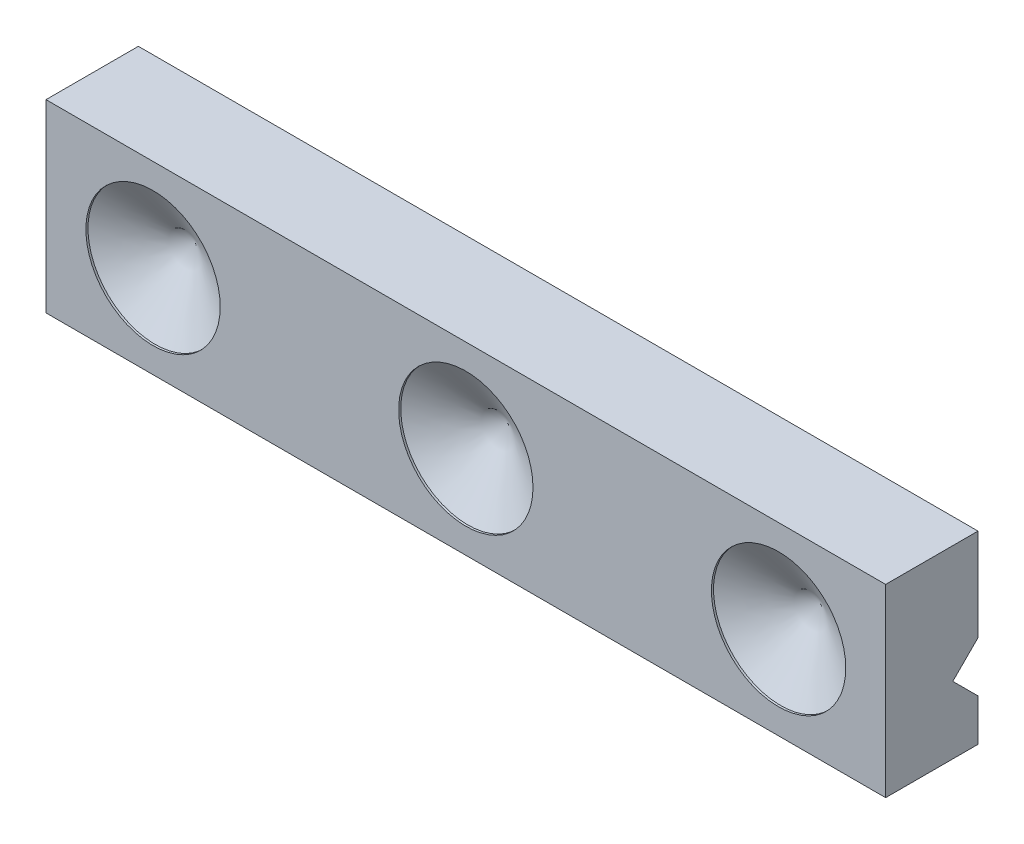
ISO-10303-21;
HEADER;
FILE_DESCRIPTION(('STEP AP214'),'2;1');
FILE_NAME('part.step','',(''),(''),'','','');
FILE_SCHEMA(('AUTOMOTIVE_DESIGN { 1 0 10303 214 1 1 1 1 }'));
ENDSEC;
DATA;
#1=APPLICATION_CONTEXT('core data for automotive mechanical design processes');
#2=APPLICATION_PROTOCOL_DEFINITION('international standard','automotive_design',2000,#1);
#3=PRODUCT_CONTEXT('',#1,'mechanical');
#4=PRODUCT('Part','Part','',(#3));
#5=PRODUCT_RELATED_PRODUCT_CATEGORY('part','',(#4));
#6=PRODUCT_DEFINITION_FORMATION('','',#4);
#7=PRODUCT_DEFINITION_CONTEXT('part definition',#1,'design');
#8=PRODUCT_DEFINITION('design','',#6,#7);
#9=PRODUCT_DEFINITION_SHAPE('','',#8);
#10=(LENGTH_UNIT() NAMED_UNIT(*) SI_UNIT(.MILLI.,.METRE.));
#11=(NAMED_UNIT(*) PLANE_ANGLE_UNIT() SI_UNIT($,.RADIAN.));
#12=(NAMED_UNIT(*) SI_UNIT($,.STERADIAN.) SOLID_ANGLE_UNIT());
#13=UNCERTAINTY_MEASURE_WITH_UNIT(LENGTH_MEASURE(1.E-05),#10,'distance_accuracy_value','');
#14=(GEOMETRIC_REPRESENTATION_CONTEXT(3) GLOBAL_UNCERTAINTY_ASSIGNED_CONTEXT((#13)) GLOBAL_UNIT_ASSIGNED_CONTEXT((#10,
#11,#12)) REPRESENTATION_CONTEXT('',''));
#15=CARTESIAN_POINT('',(0.,0.,0.));
#16=DIRECTION('',(0.,0.,1.));
#17=DIRECTION('',(1.,0.,0.));
#18=AXIS2_PLACEMENT_3D('',#15,#16,#17);
#19=CARTESIAN_POINT('',(-10.,-1.60000000000001,19.5));
#20=DIRECTION('',(1.,0.,0.));
#21=DIRECTION('',(0.,0.,-1.));
#22=AXIS2_PLACEMENT_3D('',#19,#20,#21);
#23=PLANE('',#22);
#24=DIRECTION('',(0.,0.,-1.));
#25=VECTOR('',#24,1.);
#26=CARTESIAN_POINT('',(-10.,2.8,19.5));
#27=LINE('',#26,#25);
#28=CARTESIAN_POINT('',(-10.,2.8,19.5));
#29=VERTEX_POINT('',#28);
#30=CARTESIAN_POINT('',(-10.,2.8,17.3));
#31=VERTEX_POINT('',#30);
#32=EDGE_CURVE('E205',#29,#31,#27,.T.);
#33=ORIENTED_EDGE('',*,*,#32,.T.);
#34=DIRECTION('',(0.,1.,0.));
#35=VECTOR('',#34,1.);
#36=CARTESIAN_POINT('',(-10.,2.8,17.3));
#37=LINE('',#36,#35);
#38=CARTESIAN_POINT('',(-10.,0.600000000000007,17.3));
#39=VERTEX_POINT('',#38);
#40=EDGE_CURVE('E174',#39,#31,#37,.T.);
#41=ORIENTED_EDGE('',*,*,#40,.F.);
#42=DIRECTION('',(0.,-0.707106781186542,0.707106781186553));
#43=VECTOR('',#42,1.);
#44=CARTESIAN_POINT('',(-10.,-1.59999999999999,19.5));
#45=LINE('',#44,#43);
#46=CARTESIAN_POINT('',(-10.,0.,17.9));
#47=VERTEX_POINT('',#46);
#48=EDGE_CURVE('E70',#39,#47,#45,.T.);
#49=ORIENTED_EDGE('',*,*,#48,.T.);
#50=DIRECTION('',(0.,-0.707106781186542,-0.707106781186553));
#51=VECTOR('',#50,1.);
#52=CARTESIAN_POINT('',(-10.,0.,17.9));
#53=LINE('',#52,#51);
#54=CARTESIAN_POINT('',(-10.,-0.6,17.3));
#55=VERTEX_POINT('',#54);
#56=EDGE_CURVE('E219',#47,#55,#53,.T.);
#57=ORIENTED_EDGE('',*,*,#56,.T.);
#58=DIRECTION('',(0.,1.,0.));
#59=VECTOR('',#58,1.);
#60=CARTESIAN_POINT('',(-10.,-1.60000000000001,17.3));
#61=LINE('',#60,#59);
#62=CARTESIAN_POINT('',(-10.,-1.60000000000001,17.3));
#63=VERTEX_POINT('',#62);
#64=EDGE_CURVE('E178',#63,#55,#61,.T.);
#65=ORIENTED_EDGE('',*,*,#64,.F.);
#66=DIRECTION('',(0.,0.,-1.));
#67=VECTOR('',#66,1.);
#68=CARTESIAN_POINT('',(-10.,-1.60000000000001,19.5));
#69=LINE('',#68,#67);
#70=CARTESIAN_POINT('',(-10.,-1.60000000000001,19.5));
#71=VERTEX_POINT('',#70);
#72=EDGE_CURVE('E214',#71,#63,#69,.T.);
#73=ORIENTED_EDGE('',*,*,#72,.F.);
#74=DIRECTION('',(0.,-1.,0.));
#75=VECTOR('',#74,1.);
#76=CARTESIAN_POINT('',(-10.,-1.60000000000001,19.5));
#77=LINE('',#76,#75);
#78=EDGE_CURVE('E193',#29,#71,#77,.T.);
#79=ORIENTED_EDGE('',*,*,#78,.F.);
#80=EDGE_LOOP('',(#33,#41,#49,#57,#65,#73,#79));
#81=FACE_BOUND('',#80,.T.);
#82=ADVANCED_FACE('F59',(#81),#23,.F.);
#83=CARTESIAN_POINT('',(-10.,-1.60000000000001,19.5));
#84=DIRECTION('',(0.,1.,0.));
#85=DIRECTION('',(0.,0.,1.));
#86=AXIS2_PLACEMENT_3D('',#83,#84,#85);
#87=PLANE('',#86);
#88=ORIENTED_EDGE('',*,*,#72,.T.);
#89=DIRECTION('',(-1.,0.,0.));
#90=VECTOR('',#89,1.);
#91=CARTESIAN_POINT('',(10.,-1.60000000000001,17.3));
#92=LINE('',#91,#90);
#93=CARTESIAN_POINT('',(10.,-1.60000000000001,17.3));
#94=VERTEX_POINT('',#93);
#95=EDGE_CURVE('E189',#94,#63,#92,.T.);
#96=ORIENTED_EDGE('',*,*,#95,.F.);
#97=DIRECTION('',(0.,0.,-1.));
#98=VECTOR('',#97,1.);
#99=CARTESIAN_POINT('',(10.,-1.60000000000001,19.5));
#100=LINE('',#99,#98);
#101=CARTESIAN_POINT('',(10.,-1.60000000000001,19.5));
#102=VERTEX_POINT('',#101);
#103=EDGE_CURVE('E211',#102,#94,#100,.T.);
#104=ORIENTED_EDGE('',*,*,#103,.F.);
#105=DIRECTION('',(1.,0.,0.));
#106=VECTOR('',#105,1.);
#107=CARTESIAN_POINT('',(-10.,-1.60000000000001,19.5));
#108=LINE('',#107,#106);
#109=EDGE_CURVE('E197',#71,#102,#108,.T.);
#110=ORIENTED_EDGE('',*,*,#109,.F.);
#111=EDGE_LOOP('',(#88,#96,#104,#110));
#112=FACE_BOUND('',#111,.T.);
#113=ADVANCED_FACE('F302',(#112),#87,.F.);
#114=CARTESIAN_POINT('',(10.,-1.60000000000001,19.5));
#115=DIRECTION('',(-1.,0.,0.));
#116=DIRECTION('',(0.,0.,1.));
#117=AXIS2_PLACEMENT_3D('',#114,#115,#116);
#118=PLANE('',#117);
#119=ORIENTED_EDGE('',*,*,#103,.T.);
#120=DIRECTION('',(0.,-1.,0.));
#121=VECTOR('',#120,1.);
#122=CARTESIAN_POINT('',(10.,-0.6,17.3));
#123=LINE('',#122,#121);
#124=CARTESIAN_POINT('',(10.,-0.6,17.3));
#125=VERTEX_POINT('',#124);
#126=EDGE_CURVE('E185',#125,#94,#123,.T.);
#127=ORIENTED_EDGE('',*,*,#126,.F.);
#128=DIRECTION('',(0.,0.707106781186542,0.707106781186553));
#129=VECTOR('',#128,1.);
#130=CARTESIAN_POINT('',(10.,0.,17.9));
#131=LINE('',#130,#129);
#132=CARTESIAN_POINT('',(10.,0.,17.9));
#133=VERTEX_POINT('',#132);
#134=EDGE_CURVE('E83',#125,#133,#131,.T.);
#135=ORIENTED_EDGE('',*,*,#134,.T.);
#136=DIRECTION('',(0.,0.707106781186542,-0.707106781186553));
#137=VECTOR('',#136,1.);
#138=CARTESIAN_POINT('',(10.,-1.59999999999999,19.5));
#139=LINE('',#138,#137);
#140=CARTESIAN_POINT('',(10.,0.600000000000007,17.3));
#141=VERTEX_POINT('',#140);
#142=EDGE_CURVE('E11',#133,#141,#139,.T.);
#143=ORIENTED_EDGE('',*,*,#142,.T.);
#144=DIRECTION('',(0.,-1.,0.));
#145=VECTOR('',#144,1.);
#146=CARTESIAN_POINT('',(10.,0.600000000000007,17.3));
#147=LINE('',#146,#145);
#148=CARTESIAN_POINT('',(10.,2.8,17.3));
#149=VERTEX_POINT('',#148);
#150=EDGE_CURVE('E166',#149,#141,#147,.T.);
#151=ORIENTED_EDGE('',*,*,#150,.F.);
#152=DIRECTION('',(0.,0.,-1.));
#153=VECTOR('',#152,1.);
#154=CARTESIAN_POINT('',(10.,2.8,19.5));
#155=LINE('',#154,#153);
#156=CARTESIAN_POINT('',(10.,2.8,19.5));
#157=VERTEX_POINT('',#156);
#158=EDGE_CURVE('E208',#157,#149,#155,.T.);
#159=ORIENTED_EDGE('',*,*,#158,.F.);
#160=DIRECTION('',(0.,1.,0.));
#161=VECTOR('',#160,1.);
#162=CARTESIAN_POINT('',(10.,-1.60000000000001,19.5));
#163=LINE('',#162,#161);
#164=EDGE_CURVE('E200',#102,#157,#163,.T.);
#165=ORIENTED_EDGE('',*,*,#164,.F.);
#166=EDGE_LOOP('',(#119,#127,#135,#143,#151,#159,#165));
#167=FACE_BOUND('',#166,.T.);
#168=ADVANCED_FACE('F285',(#167),#118,.F.);
#169=CARTESIAN_POINT('',(-10.,2.8,19.5));
#170=DIRECTION('',(0.,-1.,0.));
#171=DIRECTION('',(0.,0.,-1.));
#172=AXIS2_PLACEMENT_3D('',#169,#170,#171);
#173=PLANE('',#172);
#174=ORIENTED_EDGE('',*,*,#158,.T.);
#175=DIRECTION('',(1.,0.,0.));
#176=VECTOR('',#175,1.);
#177=CARTESIAN_POINT('',(10.,2.8,17.3));
#178=LINE('',#177,#176);
#179=EDGE_CURVE('E170',#31,#149,#178,.T.);
#180=ORIENTED_EDGE('',*,*,#179,.F.);
#181=ORIENTED_EDGE('',*,*,#32,.F.);
#182=DIRECTION('',(-1.,0.,0.));
#183=VECTOR('',#182,1.);
#184=CARTESIAN_POINT('',(-10.,2.8,19.5));
#185=LINE('',#184,#183);
#186=EDGE_CURVE('E203',#157,#29,#185,.T.);
#187=ORIENTED_EDGE('',*,*,#186,.F.);
#188=EDGE_LOOP('',(#174,#180,#181,#187));
#189=FACE_BOUND('',#188,.T.);
#190=ADVANCED_FACE('F292',(#189),#173,.F.);
#191=CARTESIAN_POINT('',(0.,0.,19.5));
#192=DIRECTION('',(0.,0.,-1.));
#193=DIRECTION('',(-1.,0.,0.));
#194=AXIS2_PLACEMENT_3D('',#191,#192,#193);
#195=PLANE('',#194);
#196=CARTESIAN_POINT('',(-7.45,0.600000000000002,19.5));
#197=DIRECTION('',(0.,0.,1.));
#198=DIRECTION('',(1.,0.,0.));
#199=AXIS2_PLACEMENT_3D('',#196,#197,#198);
#200=CIRCLE('',#199,1.6);
#201=CARTESIAN_POINT('',(-5.85,0.600000000000002,19.5));
#202=VERTEX_POINT('',#201);
#203=EDGE_CURVE('E139',#202,#202,#200,.T.);
#204=ORIENTED_EDGE('',*,*,#203,.F.);
#205=EDGE_LOOP('',(#204));
#206=FACE_BOUND('',#205,.T.);
#207=CARTESIAN_POINT('',(0.,0.600000000000002,19.5));
#208=DIRECTION('',(0.,0.,1.));
#209=DIRECTION('',(1.,0.,0.));
#210=AXIS2_PLACEMENT_3D('',#207,#208,#209);
#211=CIRCLE('',#210,1.6);
#212=CARTESIAN_POINT('',(1.6,0.600000000000002,19.5));
#213=VERTEX_POINT('',#212);
#214=EDGE_CURVE('E138',#213,#213,#211,.T.);
#215=ORIENTED_EDGE('',*,*,#214,.F.);
#216=EDGE_LOOP('',(#215));
#217=FACE_BOUND('',#216,.T.);
#218=CARTESIAN_POINT('',(7.45000000000001,0.600000000000002,19.5));
#219=DIRECTION('',(0.,0.,1.));
#220=DIRECTION('',(1.,0.,0.));
#221=AXIS2_PLACEMENT_3D('',#218,#219,#220);
#222=CIRCLE('',#221,1.6);
#223=CARTESIAN_POINT('',(9.05000000000001,0.600000000000002,19.5));
#224=VERTEX_POINT('',#223);
#225=EDGE_CURVE('E155',#224,#224,#222,.T.);
#226=ORIENTED_EDGE('',*,*,#225,.F.);
#227=EDGE_LOOP('',(#226));
#228=FACE_BOUND('',#227,.T.);
#229=ORIENTED_EDGE('',*,*,#78,.T.);
#230=ORIENTED_EDGE('',*,*,#109,.T.);
#231=ORIENTED_EDGE('',*,*,#164,.T.);
#232=ORIENTED_EDGE('',*,*,#186,.T.);
#233=EDGE_LOOP('',(#229,#230,#231,#232));
#234=FACE_BOUND('',#233,.T.);
#235=ADVANCED_FACE('F298',(#206,#217,#228,#234),#195,.F.);
#236=CARTESIAN_POINT('',(0.,0.,17.3));
#237=DIRECTION('',(0.,0.,-1.));
#238=DIRECTION('',(-1.,0.,0.));
#239=AXIS2_PLACEMENT_3D('',#236,#237,#238);
#240=PLANE('',#239);
#241=ORIENTED_EDGE('',*,*,#64,.T.);
#242=DIRECTION('',(1.,0.,0.));
#243=VECTOR('',#242,1.);
#244=CARTESIAN_POINT('',(-10.,-0.6,17.3));
#245=LINE('',#244,#243);
#246=EDGE_CURVE('E181',#55,#125,#245,.T.);
#247=ORIENTED_EDGE('',*,*,#246,.T.);
#248=ORIENTED_EDGE('',*,*,#126,.T.);
#249=ORIENTED_EDGE('',*,*,#95,.T.);
#250=EDGE_LOOP('',(#241,#247,#248,#249));
#251=FACE_BOUND('',#250,.T.);
#252=ADVANCED_FACE('F305',(#251),#240,.T.);
#253=CARTESIAN_POINT('',(0.,0.,17.3));
#254=DIRECTION('',(0.,0.,1.));
#255=DIRECTION('',(1.,0.,0.));
#256=AXIS2_PLACEMENT_3D('',#253,#254,#255);
#257=PLANE('',#256);
#258=ORIENTED_EDGE('',*,*,#40,.T.);
#259=ORIENTED_EDGE('',*,*,#179,.T.);
#260=ORIENTED_EDGE('',*,*,#150,.T.);
#261=DIRECTION('',(-1.,0.,0.));
#262=VECTOR('',#261,1.);
#263=CARTESIAN_POINT('',(-10.,0.600000000000007,17.3));
#264=LINE('',#263,#262);
#265=EDGE_CURVE('E163',#141,#39,#264,.T.);
#266=ORIENTED_EDGE('',*,*,#265,.T.);
#267=EDGE_LOOP('',(#258,#259,#260,#266));
#268=FACE_BOUND('',#267,.T.);
#269=ADVANCED_FACE('F288',(#268),#257,.F.);
#270=CARTESIAN_POINT('',(7.45000000000001,0.600000000000002,19.45));
#271=DIRECTION('',(0.,0.,1.));
#272=DIRECTION('',(1.,0.,0.));
#273=AXIS2_PLACEMENT_3D('',#270,#271,#272);
#274=CONICAL_SURFACE('',#273,1.6,1.02974425867666);
#275=CARTESIAN_POINT('',(7.45000000000001,0.600000000000002,18.4886230095559));
#276=VERTEX_POINT('',#275);
#277=VERTEX_LOOP('',#276);
#278=FACE_BOUND('',#277,.T.);
#279=CARTESIAN_POINT('',(7.45000000000001,0.600000000000002,19.45));
#280=DIRECTION('',(0.,0.,1.));
#281=DIRECTION('',(1.,0.,0.));
#282=AXIS2_PLACEMENT_3D('',#279,#280,#281);
#283=CIRCLE('',#282,1.6);
#284=CARTESIAN_POINT('',(9.05000000000001,0.600000000000002,19.45));
#285=VERTEX_POINT('',#284);
#286=EDGE_CURVE('E159',#285,#285,#283,.T.);
#287=ORIENTED_EDGE('',*,*,#286,.T.);
#288=EDGE_LOOP('',(#287));
#289=FACE_BOUND('',#288,.T.);
#290=ADVANCED_FACE('F334',(#278,#289),#274,.F.);
#291=CARTESIAN_POINT('',(7.45000000000001,0.600000000000002,19.5));
#292=DIRECTION('',(0.,0.,1.));
#293=DIRECTION('',(1.,0.,0.));
#294=AXIS2_PLACEMENT_3D('',#291,#292,#293);
#295=CYLINDRICAL_SURFACE('',#294,1.6);
#296=ORIENTED_EDGE('',*,*,#286,.F.);
#297=EDGE_LOOP('',(#296));
#298=FACE_BOUND('',#297,.T.);
#299=ORIENTED_EDGE('',*,*,#225,.T.);
#300=EDGE_LOOP('',(#299));
#301=FACE_BOUND('',#300,.T.);
#302=ADVANCED_FACE('F330',(#298,#301),#295,.F.);
#303=CARTESIAN_POINT('',(0.,0.600000000000002,19.45));
#304=DIRECTION('',(0.,0.,1.));
#305=DIRECTION('',(1.,0.,0.));
#306=AXIS2_PLACEMENT_3D('',#303,#304,#305);
#307=CONICAL_SURFACE('',#306,1.6,1.02974425867666);
#308=CARTESIAN_POINT('',(0.,0.600000000000002,18.4886230095559));
#309=VERTEX_POINT('',#308);
#310=VERTEX_LOOP('',#309);
#311=FACE_BOUND('',#310,.T.);
#312=CARTESIAN_POINT('',(0.,0.600000000000002,19.45));
#313=DIRECTION('',(0.,0.,1.));
#314=DIRECTION('',(1.,0.,0.));
#315=AXIS2_PLACEMENT_3D('',#312,#313,#314);
#316=CIRCLE('',#315,1.6);
#317=CARTESIAN_POINT('',(1.6,0.600000000000002,19.45));
#318=VERTEX_POINT('',#317);
#319=EDGE_CURVE('E146',#318,#318,#316,.T.);
#320=ORIENTED_EDGE('',*,*,#319,.T.);
#321=EDGE_LOOP('',(#320));
#322=FACE_BOUND('',#321,.T.);
#323=ADVANCED_FACE('F326',(#311,#322),#307,.F.);
#324=CARTESIAN_POINT('',(0.,0.600000000000002,19.5));
#325=DIRECTION('',(0.,0.,1.));
#326=DIRECTION('',(1.,0.,0.));
#327=AXIS2_PLACEMENT_3D('',#324,#325,#326);
#328=CYLINDRICAL_SURFACE('',#327,1.6);
#329=ORIENTED_EDGE('',*,*,#319,.F.);
#330=EDGE_LOOP('',(#329));
#331=FACE_BOUND('',#330,.T.);
#332=ORIENTED_EDGE('',*,*,#214,.T.);
#333=EDGE_LOOP('',(#332));
#334=FACE_BOUND('',#333,.T.);
#335=ADVANCED_FACE('F131',(#331,#334),#328,.F.);
#336=CARTESIAN_POINT('',(-7.45,0.600000000000002,19.45));
#337=DIRECTION('',(0.,0.,1.));
#338=DIRECTION('',(1.,0.,0.));
#339=AXIS2_PLACEMENT_3D('',#336,#337,#338);
#340=CONICAL_SURFACE('',#339,1.6,1.02974425867666);
#341=CARTESIAN_POINT('',(-7.45,0.600000000000002,18.4886230095559));
#342=VERTEX_POINT('',#341);
#343=VERTEX_LOOP('',#342);
#344=FACE_BOUND('',#343,.T.);
#345=CARTESIAN_POINT('',(-7.45,0.600000000000002,19.45));
#346=DIRECTION('',(0.,0.,1.));
#347=DIRECTION('',(1.,0.,0.));
#348=AXIS2_PLACEMENT_3D('',#345,#346,#347);
#349=CIRCLE('',#348,1.6);
#350=CARTESIAN_POINT('',(-5.85,0.600000000000002,19.45));
#351=VERTEX_POINT('',#350);
#352=EDGE_CURVE('E135',#351,#351,#349,.T.);
#353=ORIENTED_EDGE('',*,*,#352,.T.);
#354=EDGE_LOOP('',(#353));
#355=FACE_BOUND('',#354,.T.);
#356=ADVANCED_FACE('F127',(#344,#355),#340,.F.);
#357=CARTESIAN_POINT('',(-7.45,0.600000000000002,19.5));
#358=DIRECTION('',(0.,0.,1.));
#359=DIRECTION('',(1.,0.,0.));
#360=AXIS2_PLACEMENT_3D('',#357,#358,#359);
#361=CYLINDRICAL_SURFACE('',#360,1.6);
#362=ORIENTED_EDGE('',*,*,#352,.F.);
#363=EDGE_LOOP('',(#362));
#364=FACE_BOUND('',#363,.T.);
#365=ORIENTED_EDGE('',*,*,#203,.T.);
#366=EDGE_LOOP('',(#365));
#367=FACE_BOUND('',#366,.T.);
#368=ADVANCED_FACE('F130',(#364,#367),#361,.F.);
#369=CARTESIAN_POINT('',(-10.,0.600000000000007,17.3));
#370=DIRECTION('',(0.,0.707106781186553,0.707106781186542));
#371=DIRECTION('',(-1.,0.,0.));
#372=AXIS2_PLACEMENT_3D('',#369,#370,#371);
#373=PLANE('',#372);
#374=DIRECTION('',(-1.,0.,0.));
#375=VECTOR('',#374,1.);
#376=CARTESIAN_POINT('',(-10.,0.,17.9));
#377=LINE('',#376,#375);
#378=EDGE_CURVE('E64',#47,#133,#377,.F.);
#379=ORIENTED_EDGE('',*,*,#378,.F.);
#380=ORIENTED_EDGE('',*,*,#48,.F.);
#381=ORIENTED_EDGE('',*,*,#265,.F.);
#382=ORIENTED_EDGE('',*,*,#142,.F.);
#383=EDGE_LOOP('',(#379,#380,#381,#382));
#384=FACE_BOUND('',#383,.T.);
#385=ADVANCED_FACE('F62',(#384),#373,.F.);
#386=CARTESIAN_POINT('',(-10.,-0.6,17.3));
#387=DIRECTION('',(0.,-0.707106781186553,0.707106781186542));
#388=DIRECTION('',(1.,0.,0.));
#389=AXIS2_PLACEMENT_3D('',#386,#387,#388);
#390=PLANE('',#389);
#391=ORIENTED_EDGE('',*,*,#56,.F.);
#392=ORIENTED_EDGE('',*,*,#378,.T.);
#393=ORIENTED_EDGE('',*,*,#134,.F.);
#394=ORIENTED_EDGE('',*,*,#246,.F.);
#395=EDGE_LOOP('',(#391,#392,#393,#394));
#396=FACE_BOUND('',#395,.T.);
#397=ADVANCED_FACE('F280',(#396),#390,.F.);
#398=CLOSED_SHELL('',(#82,#113,#168,#190,#235,#252,#269,#290,#302,#323,#335,#356,#368,#385,#397));
#399=MANIFOLD_SOLID_BREP('B2',#398);
#400=ADVANCED_BREP_SHAPE_REPRESENTATION('',(#18,#399),#14);
#401=SHAPE_DEFINITION_REPRESENTATION(#9,#400);
ENDSEC;
END-ISO-10303-21;
